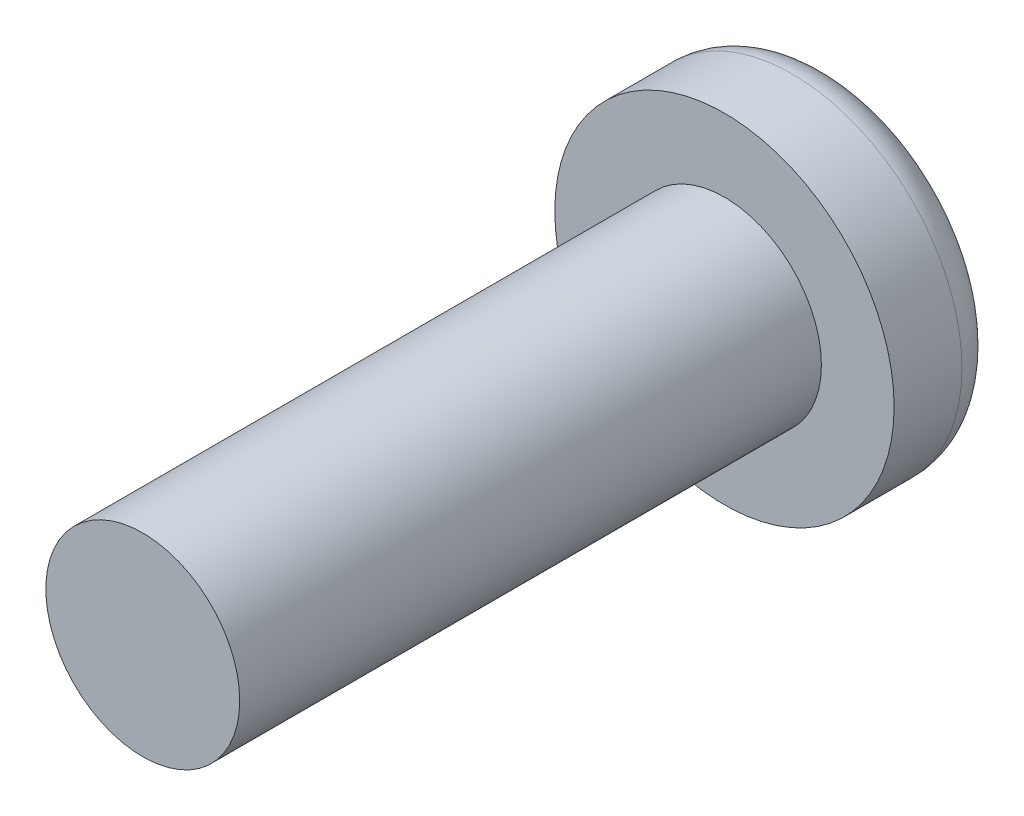
ISO-10303-21;
HEADER;
FILE_DESCRIPTION(('STEP AP214'),'2;1');
FILE_NAME('part.step','',(''),(''),'','','');
FILE_SCHEMA(('AUTOMOTIVE_DESIGN { 1 0 10303 214 1 1 1 1 }'));
ENDSEC;
DATA;
#1=APPLICATION_CONTEXT('core data for automotive mechanical design processes');
#2=APPLICATION_PROTOCOL_DEFINITION('international standard','automotive_design',2000,#1);
#3=PRODUCT_CONTEXT('',#1,'mechanical');
#4=PRODUCT('Part','Part','',(#3));
#5=PRODUCT_RELATED_PRODUCT_CATEGORY('part','',(#4));
#6=PRODUCT_DEFINITION_FORMATION('','',#4);
#7=PRODUCT_DEFINITION_CONTEXT('part definition',#1,'design');
#8=PRODUCT_DEFINITION('design','',#6,#7);
#9=PRODUCT_DEFINITION_SHAPE('','',#8);
#10=(LENGTH_UNIT() NAMED_UNIT(*) SI_UNIT(.MILLI.,.METRE.));
#11=(NAMED_UNIT(*) PLANE_ANGLE_UNIT() SI_UNIT($,.RADIAN.));
#12=(NAMED_UNIT(*) SI_UNIT($,.STERADIAN.) SOLID_ANGLE_UNIT());
#13=UNCERTAINTY_MEASURE_WITH_UNIT(LENGTH_MEASURE(1.E-05),#10,'distance_accuracy_value','');
#14=(GEOMETRIC_REPRESENTATION_CONTEXT(3) GLOBAL_UNCERTAINTY_ASSIGNED_CONTEXT((#13)) GLOBAL_UNIT_ASSIGNED_CONTEXT((#10,
#11,#12)) REPRESENTATION_CONTEXT('',''));
#15=CARTESIAN_POINT('',(0.,0.,0.));
#16=DIRECTION('',(0.,0.,1.));
#17=DIRECTION('',(1.,0.,0.));
#18=AXIS2_PLACEMENT_3D('',#15,#16,#17);
#19=CARTESIAN_POINT('',(0.,0.,30.));
#20=DIRECTION('',(0.,0.,-1.));
#21=DIRECTION('',(-1.,0.,0.));
#22=AXIS2_PLACEMENT_3D('',#19,#20,#21);
#23=CYLINDRICAL_SURFACE('',#22,5.);
#24=CARTESIAN_POINT('',(0.,0.,30.));
#25=DIRECTION('',(0.,0.,1.));
#26=DIRECTION('',(1.,0.,0.));
#27=AXIS2_PLACEMENT_3D('',#24,#25,#26);
#28=CIRCLE('',#27,5.);
#29=CARTESIAN_POINT('',(5.,0.,30.));
#30=VERTEX_POINT('',#29);
#31=EDGE_CURVE('E41',#30,#30,#28,.T.);
#32=ORIENTED_EDGE('',*,*,#31,.F.);
#33=EDGE_LOOP('',(#32));
#34=FACE_BOUND('',#33,.T.);
#35=CARTESIAN_POINT('',(0.,0.,0.));
#36=DIRECTION('',(0.,0.,1.));
#37=DIRECTION('',(1.,0.,0.));
#38=AXIS2_PLACEMENT_3D('',#35,#36,#37);
#39=CIRCLE('',#38,5.);
#40=CARTESIAN_POINT('',(5.,0.,0.));
#41=VERTEX_POINT('',#40);
#42=EDGE_CURVE('E45',#41,#41,#39,.T.);
#43=ORIENTED_EDGE('',*,*,#42,.T.);
#44=EDGE_LOOP('',(#43));
#45=FACE_BOUND('',#44,.T.);
#46=ADVANCED_FACE('F30',(#34,#45),#23,.T.);
#47=CARTESIAN_POINT('',(0.,0.,30.));
#48=DIRECTION('',(0.,0.,1.));
#49=DIRECTION('',(1.,0.,0.));
#50=AXIS2_PLACEMENT_3D('',#47,#48,#49);
#51=PLANE('',#50);
#52=ORIENTED_EDGE('',*,*,#31,.T.);
#53=EDGE_LOOP('',(#52));
#54=FACE_BOUND('',#53,.T.);
#55=ADVANCED_FACE('F70',(#54),#51,.T.);
#56=CARTESIAN_POINT('',(0.,0.,-5.5));
#57=DIRECTION('',(0.,0.,1.));
#58=DIRECTION('',(1.,0.,0.));
#59=AXIS2_PLACEMENT_3D('',#56,#57,#58);
#60=CYLINDRICAL_SURFACE('',#59,8.75);
#61=CARTESIAN_POINT('',(0.,0.,-3.5));
#62=DIRECTION('',(0.,0.,-1.));
#63=DIRECTION('',(-1.,0.,0.));
#64=AXIS2_PLACEMENT_3D('',#61,#62,#63);
#65=CIRCLE('',#64,8.75);
#66=CARTESIAN_POINT('',(-8.75,0.,-3.5));
#67=VERTEX_POINT('',#66);
#68=EDGE_CURVE('E10',#67,#67,#65,.F.);
#69=ORIENTED_EDGE('',*,*,#68,.T.);
#70=EDGE_LOOP('',(#69));
#71=FACE_BOUND('',#70,.T.);
#72=CARTESIAN_POINT('',(0.,0.,0.));
#73=DIRECTION('',(0.,0.,-1.));
#74=DIRECTION('',(-1.,0.,0.));
#75=AXIS2_PLACEMENT_3D('',#72,#73,#74);
#76=CIRCLE('',#75,8.75);
#77=CARTESIAN_POINT('',(-8.75,0.,0.));
#78=VERTEX_POINT('',#77);
#79=EDGE_CURVE('E49',#78,#78,#76,.T.);
#80=ORIENTED_EDGE('',*,*,#79,.T.);
#81=EDGE_LOOP('',(#80));
#82=FACE_BOUND('',#81,.T.);
#83=ADVANCED_FACE('F54',(#71,#82),#60,.T.);
#84=CARTESIAN_POINT('',(0.,0.,-5.5));
#85=DIRECTION('',(0.,0.,-1.));
#86=DIRECTION('',(-1.,0.,0.));
#87=AXIS2_PLACEMENT_3D('',#84,#85,#86);
#88=PLANE('',#87);
#89=CARTESIAN_POINT('',(0.,0.,-5.5));
#90=DIRECTION('',(0.,0.,-1.));
#91=DIRECTION('',(-1.,0.,0.));
#92=AXIS2_PLACEMENT_3D('',#89,#90,#91);
#93=CIRCLE('',#92,6.75);
#94=CARTESIAN_POINT('',(-6.75,0.,-5.5));
#95=VERTEX_POINT('',#94);
#96=EDGE_CURVE('E37',#95,#95,#93,.T.);
#97=ORIENTED_EDGE('',*,*,#96,.T.);
#98=EDGE_LOOP('',(#97));
#99=FACE_BOUND('',#98,.T.);
#100=ADVANCED_FACE('F58',(#99),#88,.T.);
#101=CARTESIAN_POINT('',(0.,0.,0.));
#102=DIRECTION('',(0.,0.,-1.));
#103=DIRECTION('',(-1.,0.,0.));
#104=AXIS2_PLACEMENT_3D('',#101,#102,#103);
#105=PLANE('',#104);
#106=ORIENTED_EDGE('',*,*,#42,.F.);
#107=EDGE_LOOP('',(#106));
#108=FACE_BOUND('',#107,.T.);
#109=ORIENTED_EDGE('',*,*,#79,.F.);
#110=EDGE_LOOP('',(#109));
#111=FACE_BOUND('',#110,.T.);
#112=ADVANCED_FACE('F56',(#108,#111),#105,.F.);
#113=CARTESIAN_POINT('',(0.,0.,-3.5));
#114=DIRECTION('',(0.,0.,-1.));
#115=DIRECTION('',(-1.,0.,0.));
#116=AXIS2_PLACEMENT_3D('',#113,#114,#115);
#117=TOROIDAL_SURFACE('',#116,6.75,2.);
#118=ORIENTED_EDGE('',*,*,#68,.F.);
#119=EDGE_LOOP('',(#118));
#120=FACE_BOUND('',#119,.T.);
#121=ORIENTED_EDGE('',*,*,#96,.F.);
#122=EDGE_LOOP('',(#121));
#123=FACE_BOUND('',#122,.T.);
#124=ADVANCED_FACE('F32',(#120,#123),#117,.T.);
#125=CLOSED_SHELL('',(#46,#55,#83,#100,#112,#124));
#126=MANIFOLD_SOLID_BREP('B2',#125);
#127=ADVANCED_BREP_SHAPE_REPRESENTATION('',(#18,#126),#14);
#128=SHAPE_DEFINITION_REPRESENTATION(#9,#127);
ENDSEC;
END-ISO-10303-21;
